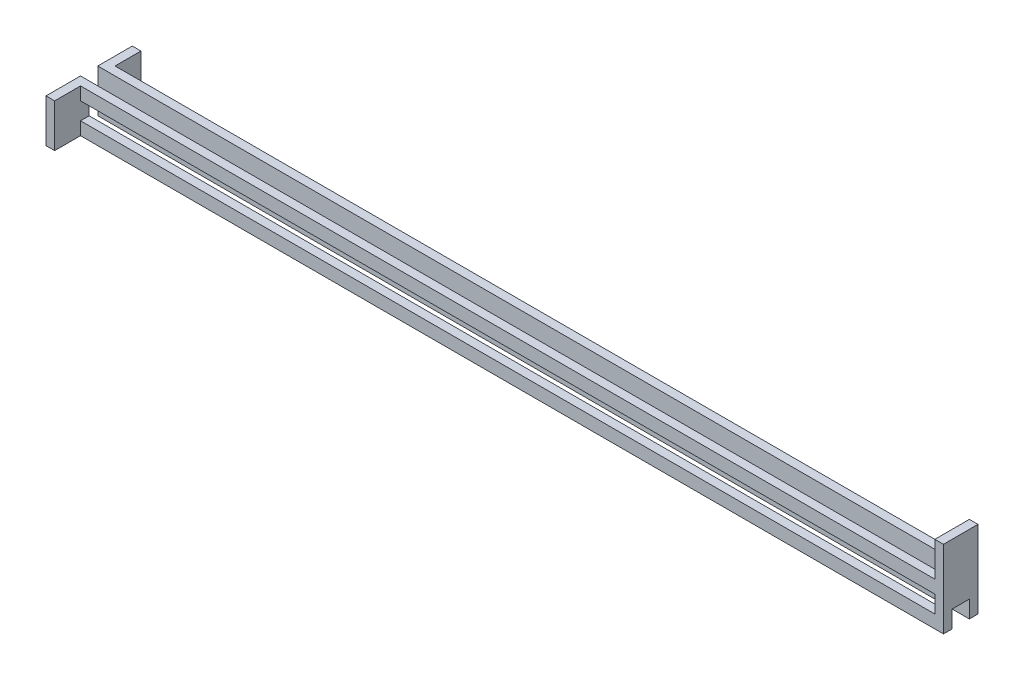
ISO-10303-21;
HEADER;
FILE_DESCRIPTION(('STEP AP214'),'2;1');
FILE_NAME('part.step','',(''),(''),'','','');
FILE_SCHEMA(('AUTOMOTIVE_DESIGN { 1 0 10303 214 1 1 1 1 }'));
ENDSEC;
DATA;
#1=APPLICATION_CONTEXT('core data for automotive mechanical design processes');
#2=APPLICATION_PROTOCOL_DEFINITION('international standard','automotive_design',2000,#1);
#3=PRODUCT_CONTEXT('',#1,'mechanical');
#4=PRODUCT('Part','Part','',(#3));
#5=PRODUCT_RELATED_PRODUCT_CATEGORY('part','',(#4));
#6=PRODUCT_DEFINITION_FORMATION('','',#4);
#7=PRODUCT_DEFINITION_CONTEXT('part definition',#1,'design');
#8=PRODUCT_DEFINITION('design','',#6,#7);
#9=PRODUCT_DEFINITION_SHAPE('','',#8);
#10=(LENGTH_UNIT() NAMED_UNIT(*) SI_UNIT(.MILLI.,.METRE.));
#11=(NAMED_UNIT(*) PLANE_ANGLE_UNIT() SI_UNIT($,.RADIAN.));
#12=(NAMED_UNIT(*) SI_UNIT($,.STERADIAN.) SOLID_ANGLE_UNIT());
#13=UNCERTAINTY_MEASURE_WITH_UNIT(LENGTH_MEASURE(1.E-05),#10,'distance_accuracy_value','');
#14=(GEOMETRIC_REPRESENTATION_CONTEXT(3) GLOBAL_UNCERTAINTY_ASSIGNED_CONTEXT((#13)) GLOBAL_UNIT_ASSIGNED_CONTEXT((#10,
#11,#12)) REPRESENTATION_CONTEXT('',''));
#15=CARTESIAN_POINT('',(0.,0.,0.));
#16=DIRECTION('',(0.,0.,1.));
#17=DIRECTION('',(1.,0.,0.));
#18=AXIS2_PLACEMENT_3D('',#15,#16,#17);
#19=CARTESIAN_POINT('',(0.,0.,0.));
#20=DIRECTION('',(0.,-1.,0.));
#21=DIRECTION('',(-1.,0.,0.));
#22=AXIS2_PLACEMENT_3D('',#19,#20,#21);
#23=PLANE('',#22);
#24=DIRECTION('',(1.,0.,0.));
#25=VECTOR('',#24,1.);
#26=CARTESIAN_POINT('',(1000.,0.,20.));
#27=LINE('',#26,#25);
#28=CARTESIAN_POINT('',(0.,0.,20.));
#29=VERTEX_POINT('',#28);
#30=CARTESIAN_POINT('',(1010.,0.,20.));
#31=VERTEX_POINT('',#30);
#32=EDGE_CURVE('E180',#29,#31,#27,.T.);
#33=ORIENTED_EDGE('',*,*,#32,.T.);
#34=DIRECTION('',(0.,0.,-1.));
#35=VECTOR('',#34,1.);
#36=CARTESIAN_POINT('',(1010.,0.,0.));
#37=LINE('',#36,#35);
#38=CARTESIAN_POINT('',(1010.,0.,30.));
#39=VERTEX_POINT('',#38);
#40=EDGE_CURVE('E184',#39,#31,#37,.T.);
#41=ORIENTED_EDGE('',*,*,#40,.F.);
#42=DIRECTION('',(1.,0.,0.));
#43=VECTOR('',#42,1.);
#44=CARTESIAN_POINT('',(1000.,0.,30.));
#45=LINE('',#44,#43);
#46=CARTESIAN_POINT('',(10.,0.,30.));
#47=VERTEX_POINT('',#46);
#48=EDGE_CURVE('E211',#47,#39,#45,.T.);
#49=ORIENTED_EDGE('',*,*,#48,.F.);
#50=DIRECTION('',(0.,0.,-1.));
#51=VECTOR('',#50,1.);
#52=CARTESIAN_POINT('',(10.,0.,20.));
#53=LINE('',#52,#51);
#54=CARTESIAN_POINT('',(10.,0.,60.));
#55=VERTEX_POINT('',#54);
#56=EDGE_CURVE('E330',#55,#47,#53,.T.);
#57=ORIENTED_EDGE('',*,*,#56,.F.);
#58=DIRECTION('',(-1.,0.,0.));
#59=VECTOR('',#58,1.);
#60=CARTESIAN_POINT('',(10.,0.,60.));
#61=LINE('',#60,#59);
#62=CARTESIAN_POINT('',(0.,0.,60.));
#63=VERTEX_POINT('',#62);
#64=EDGE_CURVE('E292',#55,#63,#61,.T.);
#65=ORIENTED_EDGE('',*,*,#64,.T.);
#66=DIRECTION('',(0.,0.,-1.));
#67=VECTOR('',#66,1.);
#68=CARTESIAN_POINT('',(0.,0.,20.));
#69=LINE('',#68,#67);
#70=EDGE_CURVE('E186',#63,#29,#69,.T.);
#71=ORIENTED_EDGE('',*,*,#70,.T.);
#72=EDGE_LOOP('',(#33,#41,#49,#57,#65,#71));
#73=FACE_BOUND('',#72,.T.);
#74=ADVANCED_FACE('F41',(#73),#23,.T.);
#75=CARTESIAN_POINT('',(10.,60.,0.));
#76=DIRECTION('',(-1.,0.,0.));
#77=DIRECTION('',(0.,0.,1.));
#78=AXIS2_PLACEMENT_3D('',#75,#76,#77);
#79=PLANE('',#78);
#80=DIRECTION('',(0.,-1.,0.));
#81=VECTOR('',#80,1.);
#82=CARTESIAN_POINT('',(10.,60.,-40.));
#83=LINE('',#82,#81);
#84=CARTESIAN_POINT('',(10.,49.9999999999981,-40.));
#85=VERTEX_POINT('',#84);
#86=CARTESIAN_POINT('',(10.,0.,-40.));
#87=VERTEX_POINT('',#86);
#88=EDGE_CURVE('E301',#85,#87,#83,.T.);
#89=ORIENTED_EDGE('',*,*,#88,.F.);
#90=DIRECTION('',(0.,0.,1.));
#91=VECTOR('',#90,1.);
#92=CARTESIAN_POINT('',(10.,49.9999999999981,0.));
#93=LINE('',#92,#91);
#94=CARTESIAN_POINT('',(10.,49.9999999999981,-10.));
#95=VERTEX_POINT('',#94);
#96=EDGE_CURVE('E64',#85,#95,#93,.T.);
#97=ORIENTED_EDGE('',*,*,#96,.T.);
#98=DIRECTION('',(0.,-1.,0.));
#99=VECTOR('',#98,1.);
#100=CARTESIAN_POINT('',(10.,60.,-10.));
#101=LINE('',#100,#99);
#102=CARTESIAN_POINT('',(10.,0.,-10.));
#103=VERTEX_POINT('',#102);
#104=EDGE_CURVE('E209',#95,#103,#101,.T.);
#105=ORIENTED_EDGE('',*,*,#104,.T.);
#106=DIRECTION('',(0.,0.,-1.));
#107=VECTOR('',#106,1.);
#108=CARTESIAN_POINT('',(10.,0.,0.));
#109=LINE('',#108,#107);
#110=EDGE_CURVE('E322',#103,#87,#109,.T.);
#111=ORIENTED_EDGE('',*,*,#110,.T.);
#112=EDGE_LOOP('',(#89,#97,#105,#111));
#113=FACE_BOUND('',#112,.T.);
#114=ADVANCED_FACE('F43',(#113),#79,.F.);
#115=CARTESIAN_POINT('',(0.,60.,0.));
#116=DIRECTION('',(-1.,0.,0.));
#117=DIRECTION('',(0.,0.,1.));
#118=AXIS2_PLACEMENT_3D('',#115,#116,#117);
#119=PLANE('',#118);
#120=DIRECTION('',(0.,0.,1.));
#121=VECTOR('',#120,1.);
#122=CARTESIAN_POINT('',(0.,49.9999999999981,0.));
#123=LINE('',#122,#121);
#124=CARTESIAN_POINT('',(0.,49.9999999999981,-40.));
#125=VERTEX_POINT('',#124);
#126=CARTESIAN_POINT('',(0.,49.9999999999981,0.));
#127=VERTEX_POINT('',#126);
#128=EDGE_CURVE('E290',#125,#127,#123,.T.);
#129=ORIENTED_EDGE('',*,*,#128,.F.);
#130=DIRECTION('',(0.,-1.,0.));
#131=VECTOR('',#130,1.);
#132=CARTESIAN_POINT('',(0.,60.,-40.));
#133=LINE('',#132,#131);
#134=CARTESIAN_POINT('',(0.,0.,-40.));
#135=VERTEX_POINT('',#134);
#136=EDGE_CURVE('E298',#125,#135,#133,.T.);
#137=ORIENTED_EDGE('',*,*,#136,.T.);
#138=DIRECTION('',(0.,0.,-1.));
#139=VECTOR('',#138,1.);
#140=CARTESIAN_POINT('',(0.,0.,0.));
#141=LINE('',#140,#139);
#142=CARTESIAN_POINT('',(0.,0.,0.));
#143=VERTEX_POINT('',#142);
#144=EDGE_CURVE('E325',#143,#135,#141,.T.);
#145=ORIENTED_EDGE('',*,*,#144,.F.);
#146=DIRECTION('',(0.,-1.,0.));
#147=VECTOR('',#146,1.);
#148=CARTESIAN_POINT('',(0.,60.,0.));
#149=LINE('',#148,#147);
#150=EDGE_CURVE('E232',#127,#143,#149,.T.);
#151=ORIENTED_EDGE('',*,*,#150,.F.);
#152=EDGE_LOOP('',(#129,#137,#145,#151));
#153=FACE_BOUND('',#152,.T.);
#154=ADVANCED_FACE('F366',(#153),#119,.T.);
#155=CARTESIAN_POINT('',(0.,60.,0.));
#156=DIRECTION('',(0.,0.,1.));
#157=DIRECTION('',(1.,0.,0.));
#158=AXIS2_PLACEMENT_3D('',#155,#156,#157);
#159=PLANE('',#158);
#160=ORIENTED_EDGE('',*,*,#150,.T.);
#161=DIRECTION('',(-1.,0.,0.));
#162=VECTOR('',#161,1.);
#163=CARTESIAN_POINT('',(0.,0.,0.));
#164=LINE('',#163,#162);
#165=CARTESIAN_POINT('',(1010.,0.,0.));
#166=VERTEX_POINT('',#165);
#167=EDGE_CURVE('E189',#166,#143,#164,.T.);
#168=ORIENTED_EDGE('',*,*,#167,.F.);
#169=DIRECTION('',(0.,-1.,0.));
#170=VECTOR('',#169,1.);
#171=CARTESIAN_POINT('',(1010.,60.,0.));
#172=LINE('',#171,#170);
#173=CARTESIAN_POINT('',(1010.,20.,0.));
#174=VERTEX_POINT('',#173);
#175=EDGE_CURVE('E198',#174,#166,#172,.T.);
#176=ORIENTED_EDGE('',*,*,#175,.F.);
#177=DIRECTION('',(1.,0.,0.));
#178=VECTOR('',#177,1.);
#179=CARTESIAN_POINT('',(0.,20.,0.));
#180=LINE('',#179,#178);
#181=CARTESIAN_POINT('',(1000.,20.,0.));
#182=VERTEX_POINT('',#181);
#183=EDGE_CURVE('E425',#182,#174,#180,.T.);
#184=ORIENTED_EDGE('',*,*,#183,.F.);
#185=DIRECTION('',(0.,-1.,0.));
#186=VECTOR('',#185,1.);
#187=CARTESIAN_POINT('',(1000.,60.,0.));
#188=LINE('',#187,#186);
#189=CARTESIAN_POINT('',(1000.,49.9999999999981,0.));
#190=VERTEX_POINT('',#189);
#191=EDGE_CURVE('E229',#190,#182,#188,.T.);
#192=ORIENTED_EDGE('',*,*,#191,.F.);
#193=DIRECTION('',(1.,0.,0.));
#194=VECTOR('',#193,1.);
#195=CARTESIAN_POINT('',(0.,49.9999999999981,0.));
#196=LINE('',#195,#194);
#197=EDGE_CURVE('E288',#127,#190,#196,.T.);
#198=ORIENTED_EDGE('',*,*,#197,.F.);
#199=EDGE_LOOP('',(#160,#168,#176,#184,#192,#198));
#200=FACE_BOUND('',#199,.T.);
#201=ADVANCED_FACE('F397',(#200),#159,.T.);
#202=CARTESIAN_POINT('',(1000.,60.,0.));
#203=DIRECTION('',(-1.,0.,0.));
#204=DIRECTION('',(0.,0.,1.));
#205=AXIS2_PLACEMENT_3D('',#202,#203,#204);
#206=PLANE('',#205);
#207=DIRECTION('',(0.,1.,0.));
#208=VECTOR('',#207,1.);
#209=CARTESIAN_POINT('',(1000.,60.,20.));
#210=LINE('',#209,#208);
#211=CARTESIAN_POINT('',(1000.,14.999999999999,20.));
#212=VERTEX_POINT('',#211);
#213=CARTESIAN_POINT('',(1000.,20.,20.));
#214=VERTEX_POINT('',#213);
#215=EDGE_CURVE('E199',#212,#214,#210,.T.);
#216=ORIENTED_EDGE('',*,*,#215,.F.);
#217=DIRECTION('',(0.,0.,-1.));
#218=VECTOR('',#217,1.);
#219=CARTESIAN_POINT('',(1000.,14.999999999999,46.));
#220=LINE('',#219,#218);
#221=CARTESIAN_POINT('',(1000.,14.999999999999,30.));
#222=VERTEX_POINT('',#221);
#223=EDGE_CURVE('E261',#222,#212,#220,.T.);
#224=ORIENTED_EDGE('',*,*,#223,.F.);
#225=DIRECTION('',(0.,-1.,0.));
#226=VECTOR('',#225,1.);
#227=CARTESIAN_POINT('',(1000.,60.,30.));
#228=LINE('',#227,#226);
#229=CARTESIAN_POINT('',(1000.,34.999999999999,30.));
#230=VERTEX_POINT('',#229);
#231=EDGE_CURVE('E238',#230,#222,#228,.T.);
#232=ORIENTED_EDGE('',*,*,#231,.F.);
#233=DIRECTION('',(0.,0.,-1.));
#234=VECTOR('',#233,1.);
#235=CARTESIAN_POINT('',(1000.,34.999999999999,46.));
#236=LINE('',#235,#234);
#237=CARTESIAN_POINT('',(1000.,34.999999999999,20.));
#238=VERTEX_POINT('',#237);
#239=EDGE_CURVE('E253',#230,#238,#236,.T.);
#240=ORIENTED_EDGE('',*,*,#239,.T.);
#241=DIRECTION('',(0.,-1.,0.));
#242=VECTOR('',#241,1.);
#243=CARTESIAN_POINT('',(1000.,60.,20.));
#244=LINE('',#243,#242);
#245=CARTESIAN_POINT('',(1000.,49.9999999999981,20.));
#246=VERTEX_POINT('',#245);
#247=EDGE_CURVE('E226',#246,#238,#244,.T.);
#248=ORIENTED_EDGE('',*,*,#247,.F.);
#249=DIRECTION('',(0.,0.,1.));
#250=VECTOR('',#249,1.);
#251=CARTESIAN_POINT('',(1000.,49.9999999999981,-40.));
#252=LINE('',#251,#250);
#253=CARTESIAN_POINT('',(1000.,49.9999999999981,30.));
#254=VERTEX_POINT('',#253);
#255=EDGE_CURVE('E272',#246,#254,#252,.T.);
#256=ORIENTED_EDGE('',*,*,#255,.T.);
#257=DIRECTION('',(0.,-1.,0.));
#258=VECTOR('',#257,1.);
#259=CARTESIAN_POINT('',(1000.,90.,30.));
#260=LINE('',#259,#258);
#261=CARTESIAN_POINT('',(1000.,90.,30.));
#262=VERTEX_POINT('',#261);
#263=EDGE_CURVE('E320',#262,#254,#260,.T.);
#264=ORIENTED_EDGE('',*,*,#263,.F.);
#265=DIRECTION('',(0.,0.,1.));
#266=VECTOR('',#265,1.);
#267=CARTESIAN_POINT('',(1000.,90.,-10.));
#268=LINE('',#267,#266);
#269=CARTESIAN_POINT('',(1000.,90.,-10.));
#270=VERTEX_POINT('',#269);
#271=EDGE_CURVE('E307',#270,#262,#268,.T.);
#272=ORIENTED_EDGE('',*,*,#271,.F.);
#273=DIRECTION('',(0.,-1.,0.));
#274=VECTOR('',#273,1.);
#275=CARTESIAN_POINT('',(1000.,90.,-10.));
#276=LINE('',#275,#274);
#277=CARTESIAN_POINT('',(1000.,49.9999999999981,-10.));
#278=VERTEX_POINT('',#277);
#279=EDGE_CURVE('E318',#270,#278,#276,.T.);
#280=ORIENTED_EDGE('',*,*,#279,.T.);
#281=EDGE_CURVE('E275',#278,#190,#252,.T.);
#282=ORIENTED_EDGE('',*,*,#281,.T.);
#283=ORIENTED_EDGE('',*,*,#191,.T.);
#284=DIRECTION('',(0.,0.,-1.));
#285=VECTOR('',#284,1.);
#286=CARTESIAN_POINT('',(1000.,20.,0.));
#287=LINE('',#286,#285);
#288=EDGE_CURVE('E424',#214,#182,#287,.T.);
#289=ORIENTED_EDGE('',*,*,#288,.F.);
#290=EDGE_LOOP('',(#216,#224,#232,#240,#248,#256,#264,#272,#280,#282,#283,#289));
#291=FACE_BOUND('',#290,.T.);
#292=ADVANCED_FACE('F345',(#291),#206,.T.);
#293=CARTESIAN_POINT('',(1000.,60.,20.));
#294=DIRECTION('',(0.,0.,-1.));
#295=DIRECTION('',(-1.,0.,0.));
#296=AXIS2_PLACEMENT_3D('',#293,#294,#295);
#297=PLANE('',#296);
#298=DIRECTION('',(0.,-1.,0.));
#299=VECTOR('',#298,1.);
#300=CARTESIAN_POINT('',(10.,60.,20.));
#301=LINE('',#300,#299);
#302=CARTESIAN_POINT('',(10.,34.999999999999,20.));
#303=VERTEX_POINT('',#302);
#304=CARTESIAN_POINT('',(10.,14.999999999999,20.));
#305=VERTEX_POINT('',#304);
#306=EDGE_CURVE('E257',#303,#305,#301,.T.);
#307=ORIENTED_EDGE('',*,*,#306,.T.);
#308=DIRECTION('',(1.,0.,0.));
#309=VECTOR('',#308,1.);
#310=CARTESIAN_POINT('',(1000.,14.999999999999,20.));
#311=LINE('',#310,#309);
#312=EDGE_CURVE('E259',#305,#212,#311,.T.);
#313=ORIENTED_EDGE('',*,*,#312,.T.);
#314=ORIENTED_EDGE('',*,*,#215,.T.);
#315=DIRECTION('',(1.,0.,0.));
#316=VECTOR('',#315,1.);
#317=CARTESIAN_POINT('',(0.,20.,20.));
#318=LINE('',#317,#316);
#319=CARTESIAN_POINT('',(1010.,20.,20.));
#320=VERTEX_POINT('',#319);
#321=EDGE_CURVE('E196',#214,#320,#318,.T.);
#322=ORIENTED_EDGE('',*,*,#321,.T.);
#323=DIRECTION('',(0.,1.,0.));
#324=VECTOR('',#323,1.);
#325=CARTESIAN_POINT('',(1010.,60.,20.));
#326=LINE('',#325,#324);
#327=EDGE_CURVE('E193',#31,#320,#326,.T.);
#328=ORIENTED_EDGE('',*,*,#327,.F.);
#329=ORIENTED_EDGE('',*,*,#32,.F.);
#330=DIRECTION('',(0.,-1.,0.));
#331=VECTOR('',#330,1.);
#332=CARTESIAN_POINT('',(0.,60.,20.));
#333=LINE('',#332,#331);
#334=CARTESIAN_POINT('',(0.,49.9999999999981,20.));
#335=VERTEX_POINT('',#334);
#336=EDGE_CURVE('E224',#335,#29,#333,.T.);
#337=ORIENTED_EDGE('',*,*,#336,.F.);
#338=DIRECTION('',(-1.,0.,0.));
#339=VECTOR('',#338,1.);
#340=CARTESIAN_POINT('',(1000.,49.9999999999981,20.));
#341=LINE('',#340,#339);
#342=EDGE_CURVE('E286',#246,#335,#341,.T.);
#343=ORIENTED_EDGE('',*,*,#342,.F.);
#344=ORIENTED_EDGE('',*,*,#247,.T.);
#345=DIRECTION('',(1.,0.,0.));
#346=VECTOR('',#345,1.);
#347=CARTESIAN_POINT('',(1000.,34.999999999999,20.));
#348=LINE('',#347,#346);
#349=EDGE_CURVE('E268',#303,#238,#348,.T.);
#350=ORIENTED_EDGE('',*,*,#349,.F.);
#351=EDGE_LOOP('',(#307,#313,#314,#322,#328,#329,#337,#343,#344,#350));
#352=FACE_BOUND('',#351,.T.);
#353=ADVANCED_FACE('F194',(#352),#297,.T.);
#354=CARTESIAN_POINT('',(0.,60.,20.));
#355=DIRECTION('',(-1.,0.,0.));
#356=DIRECTION('',(0.,0.,1.));
#357=AXIS2_PLACEMENT_3D('',#354,#355,#356);
#358=PLANE('',#357);
#359=DIRECTION('',(0.,0.,1.));
#360=VECTOR('',#359,1.);
#361=CARTESIAN_POINT('',(0.,49.9999999999981,20.));
#362=LINE('',#361,#360);
#363=CARTESIAN_POINT('',(0.,49.9999999999981,60.));
#364=VERTEX_POINT('',#363);
#365=EDGE_CURVE('E284',#335,#364,#362,.T.);
#366=ORIENTED_EDGE('',*,*,#365,.F.);
#367=ORIENTED_EDGE('',*,*,#336,.T.);
#368=ORIENTED_EDGE('',*,*,#70,.F.);
#369=DIRECTION('',(0.,1.,0.));
#370=VECTOR('',#369,1.);
#371=CARTESIAN_POINT('',(0.,60.,60.));
#372=LINE('',#371,#370);
#373=EDGE_CURVE('E295',#63,#364,#372,.T.);
#374=ORIENTED_EDGE('',*,*,#373,.T.);
#375=EDGE_LOOP('',(#366,#367,#368,#374));
#376=FACE_BOUND('',#375,.T.);
#377=ADVANCED_FACE('F350',(#376),#358,.T.);
#378=CARTESIAN_POINT('',(10.,60.,20.));
#379=DIRECTION('',(-1.,0.,0.));
#380=DIRECTION('',(0.,0.,1.));
#381=AXIS2_PLACEMENT_3D('',#378,#379,#380);
#382=PLANE('',#381);
#383=DIRECTION('',(0.,0.,-1.));
#384=VECTOR('',#383,1.);
#385=CARTESIAN_POINT('',(10.,34.999999999999,46.));
#386=LINE('',#385,#384);
#387=CARTESIAN_POINT('',(10.,34.999999999999,30.));
#388=VERTEX_POINT('',#387);
#389=EDGE_CURVE('E250',#388,#303,#386,.T.);
#390=ORIENTED_EDGE('',*,*,#389,.F.);
#391=DIRECTION('',(0.,-1.,0.));
#392=VECTOR('',#391,1.);
#393=CARTESIAN_POINT('',(10.,60.,30.));
#394=LINE('',#393,#392);
#395=CARTESIAN_POINT('',(10.,49.9999999999981,30.));
#396=VERTEX_POINT('',#395);
#397=EDGE_CURVE('E221',#396,#388,#394,.T.);
#398=ORIENTED_EDGE('',*,*,#397,.F.);
#399=DIRECTION('',(0.,0.,1.));
#400=VECTOR('',#399,1.);
#401=CARTESIAN_POINT('',(10.,49.9999999999981,20.));
#402=LINE('',#401,#400);
#403=CARTESIAN_POINT('',(10.,49.9999999999981,60.));
#404=VERTEX_POINT('',#403);
#405=EDGE_CURVE('E282',#396,#404,#402,.T.);
#406=ORIENTED_EDGE('',*,*,#405,.T.);
#407=DIRECTION('',(0.,1.,0.));
#408=VECTOR('',#407,1.);
#409=CARTESIAN_POINT('',(10.,60.,60.));
#410=LINE('',#409,#408);
#411=EDGE_CURVE('E294',#55,#404,#410,.T.);
#412=ORIENTED_EDGE('',*,*,#411,.F.);
#413=ORIENTED_EDGE('',*,*,#56,.T.);
#414=CARTESIAN_POINT('',(10.,14.999999999999,30.));
#415=VERTEX_POINT('',#414);
#416=EDGE_CURVE('E220',#415,#47,#394,.T.);
#417=ORIENTED_EDGE('',*,*,#416,.F.);
#418=DIRECTION('',(0.,0.,-1.));
#419=VECTOR('',#418,1.);
#420=CARTESIAN_POINT('',(10.,14.999999999999,46.));
#421=LINE('',#420,#419);
#422=EDGE_CURVE('E56',#415,#305,#421,.T.);
#423=ORIENTED_EDGE('',*,*,#422,.T.);
#424=ORIENTED_EDGE('',*,*,#306,.F.);
#425=EDGE_LOOP('',(#390,#398,#406,#412,#413,#417,#423,#424));
#426=FACE_BOUND('',#425,.T.);
#427=ADVANCED_FACE('F255',(#426),#382,.F.);
#428=CARTESIAN_POINT('',(1000.,60.,30.));
#429=DIRECTION('',(0.,0.,-1.));
#430=DIRECTION('',(-1.,0.,0.));
#431=AXIS2_PLACEMENT_3D('',#428,#429,#430);
#432=PLANE('',#431);
#433=ORIENTED_EDGE('',*,*,#397,.T.);
#434=DIRECTION('',(1.,0.,0.));
#435=VECTOR('',#434,1.);
#436=CARTESIAN_POINT('',(1000.,34.999999999999,30.));
#437=LINE('',#436,#435);
#438=EDGE_CURVE('E49',#388,#230,#437,.T.);
#439=ORIENTED_EDGE('',*,*,#438,.T.);
#440=ORIENTED_EDGE('',*,*,#231,.T.);
#441=DIRECTION('',(1.,0.,0.));
#442=VECTOR('',#441,1.);
#443=CARTESIAN_POINT('',(1000.,14.999999999999,30.));
#444=LINE('',#443,#442);
#445=EDGE_CURVE('E236',#415,#222,#444,.T.);
#446=ORIENTED_EDGE('',*,*,#445,.F.);
#447=ORIENTED_EDGE('',*,*,#416,.T.);
#448=ORIENTED_EDGE('',*,*,#48,.T.);
#449=DIRECTION('',(0.,-1.,0.));
#450=VECTOR('',#449,1.);
#451=CARTESIAN_POINT('',(1010.,60.,30.));
#452=LINE('',#451,#450);
#453=CARTESIAN_POINT('',(1010.,90.,30.));
#454=VERTEX_POINT('',#453);
#455=EDGE_CURVE('E204',#454,#39,#452,.T.);
#456=ORIENTED_EDGE('',*,*,#455,.F.);
#457=DIRECTION('',(1.,0.,0.));
#458=VECTOR('',#457,1.);
#459=CARTESIAN_POINT('',(1000.,90.,30.));
#460=LINE('',#459,#458);
#461=EDGE_CURVE('E310',#262,#454,#460,.T.);
#462=ORIENTED_EDGE('',*,*,#461,.F.);
#463=ORIENTED_EDGE('',*,*,#263,.T.);
#464=DIRECTION('',(-1.,0.,0.));
#465=VECTOR('',#464,1.);
#466=CARTESIAN_POINT('',(1000.,49.9999999999981,30.));
#467=LINE('',#466,#465);
#468=EDGE_CURVE('E280',#254,#396,#467,.T.);
#469=ORIENTED_EDGE('',*,*,#468,.T.);
#470=EDGE_LOOP('',(#433,#439,#440,#446,#447,#448,#456,#462,#463,#469));
#471=FACE_BOUND('',#470,.T.);
#472=ADVANCED_FACE('F242',(#471),#432,.F.);
#473=CARTESIAN_POINT('',(1010.,60.,0.));
#474=DIRECTION('',(-1.,0.,0.));
#475=DIRECTION('',(0.,0.,1.));
#476=AXIS2_PLACEMENT_3D('',#473,#474,#475);
#477=PLANE('',#476);
#478=ORIENTED_EDGE('',*,*,#40,.T.);
#479=ORIENTED_EDGE('',*,*,#327,.T.);
#480=DIRECTION('',(0.,0.,-1.));
#481=VECTOR('',#480,1.);
#482=CARTESIAN_POINT('',(1010.,20.,0.));
#483=LINE('',#482,#481);
#484=EDGE_CURVE('E11',#320,#174,#483,.T.);
#485=ORIENTED_EDGE('',*,*,#484,.T.);
#486=ORIENTED_EDGE('',*,*,#175,.T.);
#487=CARTESIAN_POINT('',(1010.,0.,-10.));
#488=VERTEX_POINT('',#487);
#489=EDGE_CURVE('E206',#166,#488,#37,.T.);
#490=ORIENTED_EDGE('',*,*,#489,.T.);
#491=DIRECTION('',(0.,-1.,0.));
#492=VECTOR('',#491,1.);
#493=CARTESIAN_POINT('',(1010.,60.,-10.));
#494=LINE('',#493,#492);
#495=CARTESIAN_POINT('',(1010.,90.,-10.));
#496=VERTEX_POINT('',#495);
#497=EDGE_CURVE('E216',#496,#488,#494,.T.);
#498=ORIENTED_EDGE('',*,*,#497,.F.);
#499=DIRECTION('',(0.,0.,-1.));
#500=VECTOR('',#499,1.);
#501=CARTESIAN_POINT('',(1010.,90.,-10.));
#502=LINE('',#501,#500);
#503=EDGE_CURVE('E313',#454,#496,#502,.T.);
#504=ORIENTED_EDGE('',*,*,#503,.F.);
#505=ORIENTED_EDGE('',*,*,#455,.T.);
#506=EDGE_LOOP('',(#478,#479,#485,#486,#490,#498,#504,#505));
#507=FACE_BOUND('',#506,.T.);
#508=ADVANCED_FACE('F202',(#507),#477,.F.);
#509=CARTESIAN_POINT('',(0.,60.,-10.));
#510=DIRECTION('',(0.,0.,1.));
#511=DIRECTION('',(1.,0.,0.));
#512=AXIS2_PLACEMENT_3D('',#509,#510,#511);
#513=PLANE('',#512);
#514=DIRECTION('',(1.,0.,0.));
#515=VECTOR('',#514,1.);
#516=CARTESIAN_POINT('',(0.,49.9999999999981,-10.));
#517=LINE('',#516,#515);
#518=EDGE_CURVE('E276',#95,#278,#517,.T.);
#519=ORIENTED_EDGE('',*,*,#518,.T.);
#520=ORIENTED_EDGE('',*,*,#279,.F.);
#521=DIRECTION('',(-1.,0.,0.));
#522=VECTOR('',#521,1.);
#523=CARTESIAN_POINT('',(1000.,90.,-10.));
#524=LINE('',#523,#522);
#525=EDGE_CURVE('E316',#496,#270,#524,.T.);
#526=ORIENTED_EDGE('',*,*,#525,.F.);
#527=ORIENTED_EDGE('',*,*,#497,.T.);
#528=DIRECTION('',(1.,0.,0.));
#529=VECTOR('',#528,1.);
#530=CARTESIAN_POINT('',(0.,0.,-10.));
#531=LINE('',#530,#529);
#532=EDGE_CURVE('E205',#488,#103,#531,.F.);
#533=ORIENTED_EDGE('',*,*,#532,.T.);
#534=ORIENTED_EDGE('',*,*,#104,.F.);
#535=EDGE_LOOP('',(#519,#520,#526,#527,#533,#534));
#536=FACE_BOUND('',#535,.T.);
#537=ADVANCED_FACE('F372',(#536),#513,.F.);
#538=ORIENTED_EDGE('',*,*,#489,.F.);
#539=ORIENTED_EDGE('',*,*,#167,.T.);
#540=ORIENTED_EDGE('',*,*,#144,.T.);
#541=DIRECTION('',(-1.,0.,0.));
#542=VECTOR('',#541,1.);
#543=CARTESIAN_POINT('',(10.,0.,-40.));
#544=LINE('',#543,#542);
#545=EDGE_CURVE('E303',#87,#135,#544,.T.);
#546=ORIENTED_EDGE('',*,*,#545,.F.);
#547=ORIENTED_EDGE('',*,*,#110,.F.);
#548=ORIENTED_EDGE('',*,*,#532,.F.);
#549=EDGE_LOOP('',(#538,#539,#540,#546,#547,#548));
#550=FACE_BOUND('',#549,.T.);
#551=ADVANCED_FACE('F361',(#550),#23,.T.);
#552=CARTESIAN_POINT('',(0.,90.,0.));
#553=DIRECTION('',(0.,1.,0.));
#554=DIRECTION('',(0.,0.,1.));
#555=AXIS2_PLACEMENT_3D('',#552,#553,#554);
#556=PLANE('',#555);
#557=ORIENTED_EDGE('',*,*,#271,.T.);
#558=ORIENTED_EDGE('',*,*,#461,.T.);
#559=ORIENTED_EDGE('',*,*,#503,.T.);
#560=ORIENTED_EDGE('',*,*,#525,.T.);
#561=EDGE_LOOP('',(#557,#558,#559,#560));
#562=FACE_BOUND('',#561,.T.);
#563=ADVANCED_FACE('F371',(#562),#556,.T.);
#564=CARTESIAN_POINT('',(10.,60.,-40.));
#565=DIRECTION('',(0.,0.,-1.));
#566=DIRECTION('',(0.,1.,0.));
#567=AXIS2_PLACEMENT_3D('',#564,#565,#566);
#568=PLANE('',#567);
#569=DIRECTION('',(1.,0.,0.));
#570=VECTOR('',#569,1.);
#571=CARTESIAN_POINT('',(-28.133255752665,49.9999999999981,-40.));
#572=LINE('',#571,#570);
#573=EDGE_CURVE('E270',#125,#85,#572,.T.);
#574=ORIENTED_EDGE('',*,*,#573,.T.);
#575=ORIENTED_EDGE('',*,*,#88,.T.);
#576=ORIENTED_EDGE('',*,*,#545,.T.);
#577=ORIENTED_EDGE('',*,*,#136,.F.);
#578=EDGE_LOOP('',(#574,#575,#576,#577));
#579=FACE_BOUND('',#578,.T.);
#580=ADVANCED_FACE('F377',(#579),#568,.T.);
#581=CARTESIAN_POINT('',(10.,60.,60.));
#582=DIRECTION('',(0.,0.,1.));
#583=DIRECTION('',(0.,-1.,0.));
#584=AXIS2_PLACEMENT_3D('',#581,#582,#583);
#585=PLANE('',#584);
#586=DIRECTION('',(1.,0.,0.));
#587=VECTOR('',#586,1.);
#588=CARTESIAN_POINT('',(10.,49.9999999999981,60.));
#589=LINE('',#588,#587);
#590=EDGE_CURVE('E234',#364,#404,#589,.T.);
#591=ORIENTED_EDGE('',*,*,#590,.F.);
#592=ORIENTED_EDGE('',*,*,#373,.F.);
#593=ORIENTED_EDGE('',*,*,#64,.F.);
#594=ORIENTED_EDGE('',*,*,#411,.T.);
#595=EDGE_LOOP('',(#591,#592,#593,#594));
#596=FACE_BOUND('',#595,.T.);
#597=ADVANCED_FACE('F338',(#596),#585,.T.);
#598=CARTESIAN_POINT('',(-28.133255752665,49.9999999999981,-40.));
#599=DIRECTION('',(0.,-1.,0.));
#600=DIRECTION('',(1.,0.,0.));
#601=AXIS2_PLACEMENT_3D('',#598,#599,#600);
#602=PLANE('',#601);
#603=ORIENTED_EDGE('',*,*,#342,.T.);
#604=ORIENTED_EDGE('',*,*,#365,.T.);
#605=ORIENTED_EDGE('',*,*,#590,.T.);
#606=ORIENTED_EDGE('',*,*,#405,.F.);
#607=ORIENTED_EDGE('',*,*,#468,.F.);
#608=ORIENTED_EDGE('',*,*,#255,.F.);
#609=EDGE_LOOP('',(#603,#604,#605,#606,#607,#608));
#610=FACE_BOUND('',#609,.T.);
#611=ADVANCED_FACE('F341',(#610),#602,.F.);
#612=ORIENTED_EDGE('',*,*,#128,.T.);
#613=ORIENTED_EDGE('',*,*,#197,.T.);
#614=ORIENTED_EDGE('',*,*,#281,.F.);
#615=ORIENTED_EDGE('',*,*,#518,.F.);
#616=ORIENTED_EDGE('',*,*,#96,.F.);
#617=ORIENTED_EDGE('',*,*,#573,.F.);
#618=EDGE_LOOP('',(#612,#613,#614,#615,#616,#617));
#619=FACE_BOUND('',#618,.T.);
#620=ADVANCED_FACE('F392',(#619),#602,.F.);
#621=CARTESIAN_POINT('',(0.,34.999999999999,46.));
#622=DIRECTION('',(0.,1.,0.));
#623=DIRECTION('',(0.,0.,1.));
#624=AXIS2_PLACEMENT_3D('',#621,#622,#623);
#625=PLANE('',#624);
#626=ORIENTED_EDGE('',*,*,#349,.T.);
#627=ORIENTED_EDGE('',*,*,#239,.F.);
#628=ORIENTED_EDGE('',*,*,#438,.F.);
#629=ORIENTED_EDGE('',*,*,#389,.T.);
#630=EDGE_LOOP('',(#626,#627,#628,#629));
#631=FACE_BOUND('',#630,.T.);
#632=ADVANCED_FACE('F249',(#631),#625,.F.);
#633=CARTESIAN_POINT('',(0.,14.999999999999,46.));
#634=DIRECTION('',(0.,1.,0.));
#635=DIRECTION('',(0.,0.,1.));
#636=AXIS2_PLACEMENT_3D('',#633,#634,#635);
#637=PLANE('',#636);
#638=ORIENTED_EDGE('',*,*,#422,.F.);
#639=ORIENTED_EDGE('',*,*,#445,.T.);
#640=ORIENTED_EDGE('',*,*,#223,.T.);
#641=ORIENTED_EDGE('',*,*,#312,.F.);
#642=EDGE_LOOP('',(#638,#639,#640,#641));
#643=FACE_BOUND('',#642,.T.);
#644=ADVANCED_FACE('F414',(#643),#637,.T.);
#645=CARTESIAN_POINT('',(0.,20.,20.));
#646=DIRECTION('',(0.,1.,0.));
#647=DIRECTION('',(0.,0.,1.));
#648=AXIS2_PLACEMENT_3D('',#645,#646,#647);
#649=PLANE('',#648);
#650=ORIENTED_EDGE('',*,*,#288,.T.);
#651=ORIENTED_EDGE('',*,*,#183,.T.);
#652=ORIENTED_EDGE('',*,*,#484,.F.);
#653=ORIENTED_EDGE('',*,*,#321,.F.);
#654=EDGE_LOOP('',(#650,#651,#652,#653));
#655=FACE_BOUND('',#654,.T.);
#656=ADVANCED_FACE('F417',(#655),#649,.F.);
#657=CLOSED_SHELL('',(#74,#114,#154,#201,#292,#353,#377,#427,#472,#508,#537,#551,#563,#580,#597,
#611,#620,#632,#644,#656));
#658=MANIFOLD_SOLID_BREP('B2',#657);
#659=ADVANCED_BREP_SHAPE_REPRESENTATION('',(#18,#658),#14);
#660=SHAPE_DEFINITION_REPRESENTATION(#9,#659);
ENDSEC;
END-ISO-10303-21;
